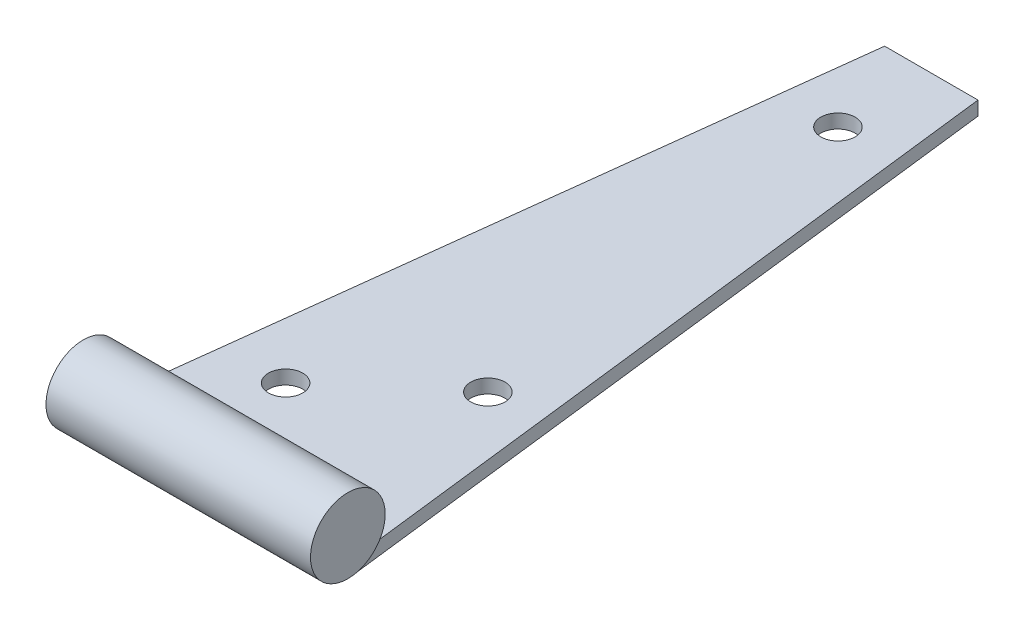
ISO-10303-21;
HEADER;
FILE_DESCRIPTION(('STEP AP214'),'2;1');
FILE_NAME('part.step','',(''),(''),'','','');
FILE_SCHEMA(('AUTOMOTIVE_DESIGN { 1 0 10303 214 1 1 1 1 }'));
ENDSEC;
DATA;
#1=APPLICATION_CONTEXT('core data for automotive mechanical design processes');
#2=APPLICATION_PROTOCOL_DEFINITION('international standard','automotive_design',2000,#1);
#3=PRODUCT_CONTEXT('',#1,'mechanical');
#4=PRODUCT('Part','Part','',(#3));
#5=PRODUCT_RELATED_PRODUCT_CATEGORY('part','',(#4));
#6=PRODUCT_DEFINITION_FORMATION('','',#4);
#7=PRODUCT_DEFINITION_CONTEXT('part definition',#1,'design');
#8=PRODUCT_DEFINITION('design','',#6,#7);
#9=PRODUCT_DEFINITION_SHAPE('','',#8);
#10=(LENGTH_UNIT() NAMED_UNIT(*) SI_UNIT(.MILLI.,.METRE.));
#11=(NAMED_UNIT(*) PLANE_ANGLE_UNIT() SI_UNIT($,.RADIAN.));
#12=(NAMED_UNIT(*) SI_UNIT($,.STERADIAN.) SOLID_ANGLE_UNIT());
#13=UNCERTAINTY_MEASURE_WITH_UNIT(LENGTH_MEASURE(1.E-05),#10,'distance_accuracy_value','');
#14=(GEOMETRIC_REPRESENTATION_CONTEXT(3) GLOBAL_UNCERTAINTY_ASSIGNED_CONTEXT((#13)) GLOBAL_UNIT_ASSIGNED_CONTEXT((#10,
#11,#12)) REPRESENTATION_CONTEXT('',''));
#15=CARTESIAN_POINT('',(0.,0.,0.));
#16=DIRECTION('',(0.,0.,1.));
#17=DIRECTION('',(1.,0.,0.));
#18=AXIS2_PLACEMENT_3D('',#15,#16,#17);
#19=CARTESIAN_POINT('',(0.,1.4224,0.));
#20=DIRECTION('',(0.992927816806674,0.,0.118719630270363));
#21=DIRECTION('',(0.118719630270363,0.,-0.992927816806674));
#22=AXIS2_PLACEMENT_3D('',#19,#20,#21);
#23=PLANE('',#22);
#24=CARTESIAN_POINT('',(0.,3.81,0.));
#25=DIRECTION('',(0.992927816806674,0.,0.118719630270363));
#26=DIRECTION('',(-0.118719630270363,0.,0.992927816806674));
#27=AXIS2_PLACEMENT_3D('',#24,#25,#26);
#28=ELLIPSE('',#27,3.83713693534463,3.81);
#29=CARTESIAN_POINT('',(0.354999303601649,1.4224,-2.96908508466834));
#30=VERTEX_POINT('',#29);
#31=CARTESIAN_POINT('',(0.,0.,0.));
#32=VERTEX_POINT('',#31);
#33=EDGE_CURVE('E67',#30,#32,#28,.F.);
#34=ORIENTED_EDGE('',*,*,#33,.F.);
#35=DIRECTION('',(-0.118719630270363,0.,0.992927816806674));
#36=VECTOR('',#35,1.);
#37=CARTESIAN_POINT('',(0.,1.4224,0.));
#38=LINE('',#37,#36);
#39=CARTESIAN_POINT('',(8.73125,1.4224,-73.025));
#40=VERTEX_POINT('',#39);
#41=EDGE_CURVE('E129',#40,#30,#38,.T.);
#42=ORIENTED_EDGE('',*,*,#41,.F.);
#43=DIRECTION('',(0.,-1.,0.));
#44=VECTOR('',#43,1.);
#45=CARTESIAN_POINT('',(8.73125,1.4224,-73.025));
#46=LINE('',#45,#44);
#47=CARTESIAN_POINT('',(8.73125,0.,-73.025));
#48=VERTEX_POINT('',#47);
#49=EDGE_CURVE('E52',#40,#48,#46,.T.);
#50=ORIENTED_EDGE('',*,*,#49,.T.);
#51=DIRECTION('',(-0.118719630270363,0.,0.992927816806674));
#52=VECTOR('',#51,1.);
#53=CARTESIAN_POINT('',(0.,0.,0.));
#54=LINE('',#53,#52);
#55=EDGE_CURVE('E112',#48,#32,#54,.T.);
#56=ORIENTED_EDGE('',*,*,#55,.T.);
#57=EDGE_LOOP('',(#34,#42,#50,#56));
#58=FACE_BOUND('',#57,.T.);
#59=ADVANCED_FACE('F44',(#58),#23,.F.);
#60=CARTESIAN_POINT('',(18.25625,1.4224,-73.025));
#61=DIRECTION('',(-0.992927816806674,0.,0.118719630270363));
#62=DIRECTION('',(0.118719630270363,0.,0.992927816806674));
#63=AXIS2_PLACEMENT_3D('',#60,#61,#62);
#64=PLANE('',#63);
#65=CARTESIAN_POINT('',(26.9875,3.81,0.));
#66=DIRECTION('',(-0.992927816806674,0.,0.118719630270363));
#67=DIRECTION('',(-0.118719630270363,0.,-0.992927816806674));
#68=AXIS2_PLACEMENT_3D('',#65,#66,#67);
#69=ELLIPSE('',#68,3.83713693534463,3.81);
#70=CARTESIAN_POINT('',(26.9875,0.,0.));
#71=VERTEX_POINT('',#70);
#72=CARTESIAN_POINT('',(26.6325006963983,1.4224,-2.96908508466834));
#73=VERTEX_POINT('',#72);
#74=EDGE_CURVE('E98',#71,#73,#69,.F.);
#75=ORIENTED_EDGE('',*,*,#74,.F.);
#76=DIRECTION('',(-0.118719630270363,0.,-0.992927816806674));
#77=VECTOR('',#76,1.);
#78=CARTESIAN_POINT('',(18.25625,0.,-73.025));
#79=LINE('',#78,#77);
#80=CARTESIAN_POINT('',(18.25625,0.,-73.025));
#81=VERTEX_POINT('',#80);
#82=EDGE_CURVE('E86',#71,#81,#79,.T.);
#83=ORIENTED_EDGE('',*,*,#82,.T.);
#84=DIRECTION('',(0.,-1.,0.));
#85=VECTOR('',#84,1.);
#86=CARTESIAN_POINT('',(18.25625,1.4224,-73.025));
#87=LINE('',#86,#85);
#88=CARTESIAN_POINT('',(18.25625,1.4224,-73.025));
#89=VERTEX_POINT('',#88);
#90=EDGE_CURVE('E11',#89,#81,#87,.T.);
#91=ORIENTED_EDGE('',*,*,#90,.F.);
#92=DIRECTION('',(-0.118719630270363,0.,-0.992927816806674));
#93=VECTOR('',#92,1.);
#94=CARTESIAN_POINT('',(18.25625,1.4224,-73.025));
#95=LINE('',#94,#93);
#96=EDGE_CURVE('E100',#73,#89,#95,.T.);
#97=ORIENTED_EDGE('',*,*,#96,.F.);
#98=EDGE_LOOP('',(#75,#83,#91,#97));
#99=FACE_BOUND('',#98,.T.);
#100=ADVANCED_FACE('F99',(#99),#64,.F.);
#101=CARTESIAN_POINT('',(0.,1.4224,0.));
#102=DIRECTION('',(0.,1.,0.));
#103=DIRECTION('',(0.,0.,1.));
#104=AXIS2_PLACEMENT_3D('',#101,#102,#103);
#105=PLANE('',#104);
#106=CARTESIAN_POINT('',(13.49375,1.4224,-63.5));
#107=DIRECTION('',(0.,1.,0.));
#108=DIRECTION('',(0.,0.,1.));
#109=AXIS2_PLACEMENT_3D('',#106,#107,#108);
#110=CIRCLE('',#109,1.7526);
#111=CARTESIAN_POINT('',(13.49375,1.4224,-61.7474));
#112=VERTEX_POINT('',#111);
#113=EDGE_CURVE('E228',#112,#112,#110,.T.);
#114=ORIENTED_EDGE('',*,*,#113,.F.);
#115=EDGE_LOOP('',(#114));
#116=FACE_BOUND('',#115,.T.);
#117=CARTESIAN_POINT('',(7.9375,1.4224,-12.7));
#118=DIRECTION('',(0.,1.,0.));
#119=DIRECTION('',(0.,0.,1.));
#120=AXIS2_PLACEMENT_3D('',#117,#118,#119);
#121=CIRCLE('',#120,1.7526);
#122=CARTESIAN_POINT('',(7.9375,1.4224,-10.9474));
#123=VERTEX_POINT('',#122);
#124=EDGE_CURVE('E230',#123,#123,#121,.T.);
#125=ORIENTED_EDGE('',*,*,#124,.F.);
#126=EDGE_LOOP('',(#125));
#127=FACE_BOUND('',#126,.T.);
#128=CARTESIAN_POINT('',(19.05,1.4224,-22.225));
#129=DIRECTION('',(0.,1.,0.));
#130=DIRECTION('',(0.,0.,1.));
#131=AXIS2_PLACEMENT_3D('',#128,#129,#130);
#132=CIRCLE('',#131,1.7526);
#133=CARTESIAN_POINT('',(19.05,1.4224,-20.4724));
#134=VERTEX_POINT('',#133);
#135=EDGE_CURVE('E241',#134,#134,#132,.T.);
#136=ORIENTED_EDGE('',*,*,#135,.F.);
#137=EDGE_LOOP('',(#136));
#138=FACE_BOUND('',#137,.T.);
#139=ORIENTED_EDGE('',*,*,#41,.T.);
#140=DIRECTION('',(-1.,0.,0.));
#141=VECTOR('',#140,1.);
#142=CARTESIAN_POINT('',(26.9875,1.4224,-2.96908508466834));
#143=LINE('',#142,#141);
#144=EDGE_CURVE('E59',#30,#73,#143,.F.);
#145=ORIENTED_EDGE('',*,*,#144,.T.);
#146=ORIENTED_EDGE('',*,*,#96,.T.);
#147=DIRECTION('',(-1.,0.,0.));
#148=VECTOR('',#147,1.);
#149=CARTESIAN_POINT('',(18.25625,1.4224,-73.025));
#150=LINE('',#149,#148);
#151=EDGE_CURVE('E134',#89,#40,#150,.T.);
#152=ORIENTED_EDGE('',*,*,#151,.T.);
#153=EDGE_LOOP('',(#139,#145,#146,#152));
#154=FACE_BOUND('',#153,.T.);
#155=ADVANCED_FACE('F146',(#116,#127,#138,#154),#105,.T.);
#156=CARTESIAN_POINT('',(18.25625,1.4224,-73.025));
#157=DIRECTION('',(0.,0.,1.));
#158=DIRECTION('',(1.,0.,0.));
#159=AXIS2_PLACEMENT_3D('',#156,#157,#158);
#160=PLANE('',#159);
#161=DIRECTION('',(-1.,0.,0.));
#162=VECTOR('',#161,1.);
#163=CARTESIAN_POINT('',(18.25625,0.,-73.025));
#164=LINE('',#163,#162);
#165=EDGE_CURVE('E92',#81,#48,#164,.T.);
#166=ORIENTED_EDGE('',*,*,#165,.T.);
#167=ORIENTED_EDGE('',*,*,#49,.F.);
#168=ORIENTED_EDGE('',*,*,#151,.F.);
#169=ORIENTED_EDGE('',*,*,#90,.T.);
#170=EDGE_LOOP('',(#166,#167,#168,#169));
#171=FACE_BOUND('',#170,.T.);
#172=ADVANCED_FACE('F145',(#171),#160,.F.);
#173=CARTESIAN_POINT('',(0.,0.,0.));
#174=DIRECTION('',(0.,1.,0.));
#175=DIRECTION('',(0.,0.,1.));
#176=AXIS2_PLACEMENT_3D('',#173,#174,#175);
#177=PLANE('',#176);
#178=CARTESIAN_POINT('',(13.49375,0.,-63.5));
#179=DIRECTION('',(0.,1.,0.));
#180=DIRECTION('',(0.,0.,1.));
#181=AXIS2_PLACEMENT_3D('',#178,#179,#180);
#182=CIRCLE('',#181,1.7526);
#183=CARTESIAN_POINT('',(13.49375,0.,-61.7474));
#184=VERTEX_POINT('',#183);
#185=EDGE_CURVE('E119',#184,#184,#182,.T.);
#186=ORIENTED_EDGE('',*,*,#185,.T.);
#187=EDGE_LOOP('',(#186));
#188=FACE_BOUND('',#187,.T.);
#189=CARTESIAN_POINT('',(7.9375,0.,-12.7));
#190=DIRECTION('',(0.,1.,0.));
#191=DIRECTION('',(0.,0.,1.));
#192=AXIS2_PLACEMENT_3D('',#189,#190,#191);
#193=CIRCLE('',#192,1.7526);
#194=CARTESIAN_POINT('',(7.9375,0.,-10.9474));
#195=VERTEX_POINT('',#194);
#196=EDGE_CURVE('E236',#195,#195,#193,.T.);
#197=ORIENTED_EDGE('',*,*,#196,.T.);
#198=EDGE_LOOP('',(#197));
#199=FACE_BOUND('',#198,.T.);
#200=CARTESIAN_POINT('',(19.05,0.,-22.225));
#201=DIRECTION('',(0.,1.,0.));
#202=DIRECTION('',(0.,0.,1.));
#203=AXIS2_PLACEMENT_3D('',#200,#201,#202);
#204=CIRCLE('',#203,1.7526);
#205=CARTESIAN_POINT('',(19.05,0.,-20.4724));
#206=VERTEX_POINT('',#205);
#207=EDGE_CURVE('E122',#206,#206,#204,.T.);
#208=ORIENTED_EDGE('',*,*,#207,.T.);
#209=EDGE_LOOP('',(#208));
#210=FACE_BOUND('',#209,.T.);
#211=ORIENTED_EDGE('',*,*,#55,.F.);
#212=ORIENTED_EDGE('',*,*,#165,.F.);
#213=ORIENTED_EDGE('',*,*,#82,.F.);
#214=DIRECTION('',(1.,0.,0.));
#215=VECTOR('',#214,1.);
#216=CARTESIAN_POINT('',(0.,0.,0.));
#217=LINE('',#216,#215);
#218=EDGE_CURVE('E91',#32,#71,#217,.T.);
#219=ORIENTED_EDGE('',*,*,#218,.F.);
#220=EDGE_LOOP('',(#211,#212,#213,#219));
#221=FACE_BOUND('',#220,.T.);
#222=ADVANCED_FACE('F89',(#188,#199,#210,#221),#177,.F.);
#223=CARTESIAN_POINT('',(26.9875,3.81,0.));
#224=DIRECTION('',(-1.,0.,0.));
#225=DIRECTION('',(0.,0.,1.));
#226=AXIS2_PLACEMENT_3D('',#223,#224,#225);
#227=CYLINDRICAL_SURFACE('',#226,3.81);
#228=ORIENTED_EDGE('',*,*,#144,.F.);
#229=ORIENTED_EDGE('',*,*,#33,.T.);
#230=CARTESIAN_POINT('',(0.,3.81,0.));
#231=DIRECTION('',(1.,0.,0.));
#232=DIRECTION('',(0.,0.,-1.));
#233=AXIS2_PLACEMENT_3D('',#230,#231,#232);
#234=CIRCLE('',#233,3.81);
#235=EDGE_CURVE('E110',#32,#32,#234,.T.);
#236=ORIENTED_EDGE('',*,*,#235,.T.);
#237=ORIENTED_EDGE('',*,*,#218,.T.);
#238=CARTESIAN_POINT('',(26.9875,3.81,0.));
#239=DIRECTION('',(1.,0.,0.));
#240=DIRECTION('',(0.,0.,-1.));
#241=AXIS2_PLACEMENT_3D('',#238,#239,#240);
#242=CIRCLE('',#241,3.81);
#243=EDGE_CURVE('E104',#71,#71,#242,.T.);
#244=ORIENTED_EDGE('',*,*,#243,.F.);
#245=ORIENTED_EDGE('',*,*,#74,.T.);
#246=EDGE_LOOP('',(#228,#229,#236,#237,#244,#245));
#247=FACE_BOUND('',#246,.T.);
#248=ADVANCED_FACE('F108',(#247),#227,.T.);
#249=CARTESIAN_POINT('',(26.9875,3.81,0.));
#250=DIRECTION('',(1.,0.,0.));
#251=DIRECTION('',(0.,0.,-1.));
#252=AXIS2_PLACEMENT_3D('',#249,#250,#251);
#253=PLANE('',#252);
#254=ORIENTED_EDGE('',*,*,#243,.T.);
#255=EDGE_LOOP('',(#254));
#256=FACE_BOUND('',#255,.T.);
#257=ADVANCED_FACE('F115',(#256),#253,.T.);
#258=CARTESIAN_POINT('',(0.,3.81,0.));
#259=DIRECTION('',(1.,0.,0.));
#260=DIRECTION('',(0.,0.,-1.));
#261=AXIS2_PLACEMENT_3D('',#258,#259,#260);
#262=PLANE('',#261);
#263=ORIENTED_EDGE('',*,*,#235,.F.);
#264=EDGE_LOOP('',(#263));
#265=FACE_BOUND('',#264,.T.);
#266=ADVANCED_FACE('F181',(#265),#262,.F.);
#267=CARTESIAN_POINT('',(19.05,0.,-22.225));
#268=DIRECTION('',(0.,1.,0.));
#269=DIRECTION('',(0.,0.,1.));
#270=AXIS2_PLACEMENT_3D('',#267,#268,#269);
#271=CYLINDRICAL_SURFACE('',#270,1.7526);
#272=ORIENTED_EDGE('',*,*,#207,.F.);
#273=EDGE_LOOP('',(#272));
#274=FACE_BOUND('',#273,.T.);
#275=ORIENTED_EDGE('',*,*,#135,.T.);
#276=EDGE_LOOP('',(#275));
#277=FACE_BOUND('',#276,.T.);
#278=ADVANCED_FACE('F188',(#274,#277),#271,.F.);
#279=CARTESIAN_POINT('',(7.9375,0.,-12.7));
#280=DIRECTION('',(0.,1.,0.));
#281=DIRECTION('',(0.,0.,1.));
#282=AXIS2_PLACEMENT_3D('',#279,#280,#281);
#283=CYLINDRICAL_SURFACE('',#282,1.7526);
#284=ORIENTED_EDGE('',*,*,#196,.F.);
#285=EDGE_LOOP('',(#284));
#286=FACE_BOUND('',#285,.T.);
#287=ORIENTED_EDGE('',*,*,#124,.T.);
#288=EDGE_LOOP('',(#287));
#289=FACE_BOUND('',#288,.T.);
#290=ADVANCED_FACE('F201',(#286,#289),#283,.F.);
#291=CARTESIAN_POINT('',(13.49375,0.,-63.5));
#292=DIRECTION('',(0.,1.,0.));
#293=DIRECTION('',(0.,0.,1.));
#294=AXIS2_PLACEMENT_3D('',#291,#292,#293);
#295=CYLINDRICAL_SURFACE('',#294,1.7526);
#296=ORIENTED_EDGE('',*,*,#185,.F.);
#297=EDGE_LOOP('',(#296));
#298=FACE_BOUND('',#297,.T.);
#299=ORIENTED_EDGE('',*,*,#113,.T.);
#300=EDGE_LOOP('',(#299));
#301=FACE_BOUND('',#300,.T.);
#302=ADVANCED_FACE('F211',(#298,#301),#295,.F.);
#303=CLOSED_SHELL('',(#59,#100,#155,#172,#222,#248,#257,#266,#278,#290,#302));
#304=MANIFOLD_SOLID_BREP('B2',#303);
#305=ADVANCED_BREP_SHAPE_REPRESENTATION('',(#18,#304),#14);
#306=SHAPE_DEFINITION_REPRESENTATION(#9,#305);
ENDSEC;
END-ISO-10303-21;
